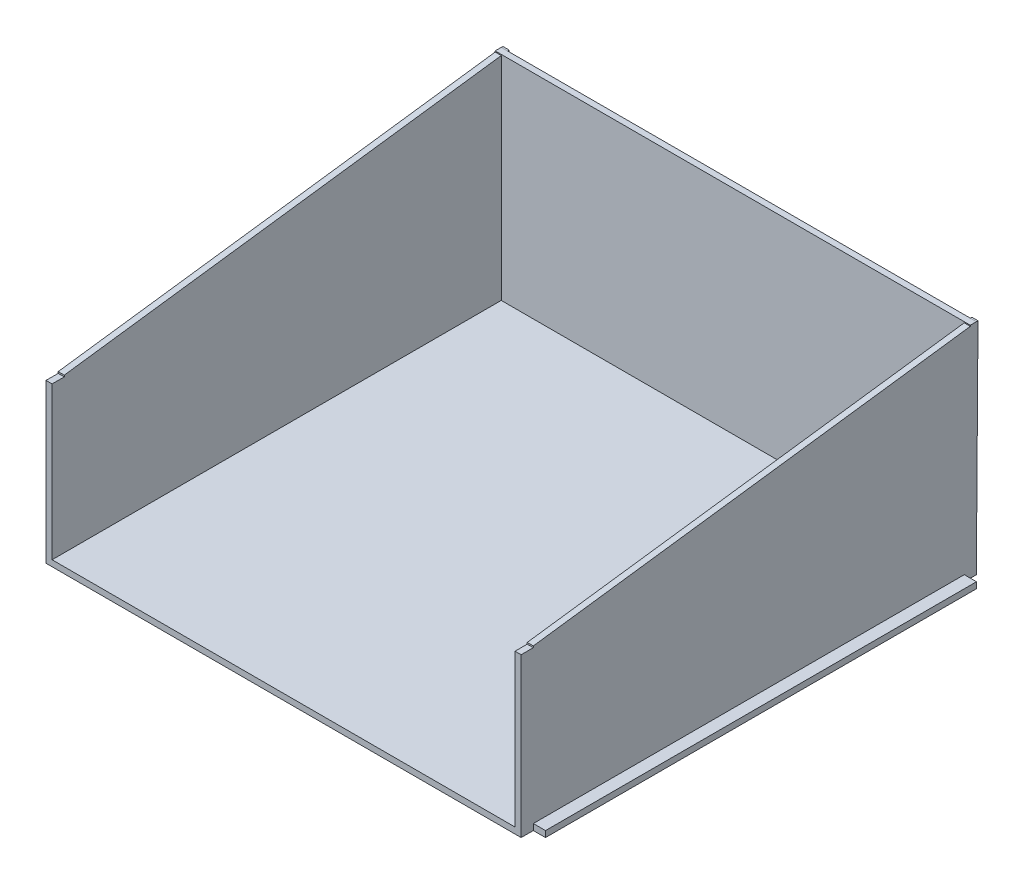
ISO-10303-21;
HEADER;
FILE_DESCRIPTION(('STEP AP214'),'2;1');
FILE_NAME('part.step','',(''),(''),'','','');
FILE_SCHEMA(('AUTOMOTIVE_DESIGN { 1 0 10303 214 1 1 1 1 }'));
ENDSEC;
DATA;
#1=APPLICATION_CONTEXT('core data for automotive mechanical design processes');
#2=APPLICATION_PROTOCOL_DEFINITION('international standard','automotive_design',2000,#1);
#3=PRODUCT_CONTEXT('',#1,'mechanical');
#4=PRODUCT('Part','Part','',(#3));
#5=PRODUCT_RELATED_PRODUCT_CATEGORY('part','',(#4));
#6=PRODUCT_DEFINITION_FORMATION('','',#4);
#7=PRODUCT_DEFINITION_CONTEXT('part definition',#1,'design');
#8=PRODUCT_DEFINITION('design','',#6,#7);
#9=PRODUCT_DEFINITION_SHAPE('','',#8);
#10=(LENGTH_UNIT() NAMED_UNIT(*) SI_UNIT(.MILLI.,.METRE.));
#11=(NAMED_UNIT(*) PLANE_ANGLE_UNIT() SI_UNIT($,.RADIAN.));
#12=(NAMED_UNIT(*) SI_UNIT($,.STERADIAN.) SOLID_ANGLE_UNIT());
#13=UNCERTAINTY_MEASURE_WITH_UNIT(LENGTH_MEASURE(1.E-05),#10,'distance_accuracy_value','');
#14=(GEOMETRIC_REPRESENTATION_CONTEXT(3) GLOBAL_UNCERTAINTY_ASSIGNED_CONTEXT((#13)) GLOBAL_UNIT_ASSIGNED_CONTEXT((#10,
#11,#12)) REPRESENTATION_CONTEXT('',''));
#15=CARTESIAN_POINT('',(0.,0.,0.));
#16=DIRECTION('',(0.,0.,1.));
#17=DIRECTION('',(1.,0.,0.));
#18=AXIS2_PLACEMENT_3D('',#15,#16,#17);
#19=CARTESIAN_POINT('',(380.000000000001,-22.8436612672275,20.));
#20=DIRECTION('',(0.,0.991227900682635,0.132163720091019));
#21=DIRECTION('',(0.,-0.132163720091019,0.991227900682635));
#22=AXIS2_PLACEMENT_3D('',#19,#20,#21);
#23=PLANE('',#22);
#24=DIRECTION('',(0.,-0.132163720091017,0.991227900682635));
#25=VECTOR('',#24,1.);
#26=CARTESIAN_POINT('',(380.000000000001,-20.1769946005609,0.));
#27=LINE('',#26,#25);
#28=CARTESIAN_POINT('',(380.000000000001,-20.1769946005609,0.));
#29=VERTEX_POINT('',#28);
#30=CARTESIAN_POINT('',(380.000000000001,-20.5294311874703,2.64327440182035));
#31=VERTEX_POINT('',#30);
#32=EDGE_CURVE('E317',#29,#31,#27,.T.);
#33=ORIENTED_EDGE('',*,*,#32,.T.);
#34=DIRECTION('',(1.,0.,0.));
#35=VECTOR('',#34,1.);
#36=CARTESIAN_POINT('',(380.000000000001,-20.5294311874703,2.64327440182035));
#37=LINE('',#36,#35);
#38=CARTESIAN_POINT('',(390.000000000001,-20.5294311874703,2.64327440182035));
#39=VERTEX_POINT('',#38);
#40=EDGE_CURVE('E55',#31,#39,#37,.T.);
#41=ORIENTED_EDGE('',*,*,#40,.T.);
#42=DIRECTION('',(0.,-0.132163720091019,0.991227900682635));
#43=VECTOR('',#42,1.);
#44=CARTESIAN_POINT('',(390.000000000001,-22.8436612672276,20.));
#45=LINE('',#44,#43);
#46=CARTESIAN_POINT('',(390.000000000001,-20.1769946005609,0.));
#47=VERTEX_POINT('',#46);
#48=EDGE_CURVE('E523',#47,#39,#45,.T.);
#49=ORIENTED_EDGE('',*,*,#48,.F.);
#50=DIRECTION('',(1.,0.,0.));
#51=VECTOR('',#50,1.);
#52=CARTESIAN_POINT('',(380.000000000001,-20.1769946005609,0.));
#53=LINE('',#52,#51);
#54=EDGE_CURVE('E446',#29,#47,#53,.T.);
#55=ORIENTED_EDGE('',*,*,#54,.F.);
#56=EDGE_LOOP('',(#33,#41,#49,#55));
#57=FACE_BOUND('',#56,.T.);
#58=ADVANCED_FACE('F32',(#57),#23,.T.);
#59=CARTESIAN_POINT('',(380.000000000001,-2.54241072639159E-13,0.));
#60=DIRECTION('',(1.,0.,0.));
#61=DIRECTION('',(0.,1.,0.));
#62=AXIS2_PLACEMENT_3D('',#59,#60,#61);
#63=PLANE('',#62);
#64=DIRECTION('',(0.,-1.,0.));
#65=VECTOR('',#64,1.);
#66=CARTESIAN_POINT('',(380.000000000001,-2.54241072639159E-13,2.64327440182035));
#67=LINE('',#66,#65);
#68=CARTESIAN_POINT('',(380.000000000001,-370.000000000002,2.64327440182035));
#69=VERTEX_POINT('',#68);
#70=EDGE_CURVE('E256',#31,#69,#67,.T.);
#71=ORIENTED_EDGE('',*,*,#70,.F.);
#72=ORIENTED_EDGE('',*,*,#32,.F.);
#73=DIRECTION('',(0.,0.999971454400032,-0.00755581796271107));
#74=VECTOR('',#73,1.);
#75=CARTESIAN_POINT('',(380.000000000001,-370.000000000002,2.64327440182035));
#76=LINE('',#75,#74);
#77=EDGE_CURVE('E324',#69,#29,#76,.T.);
#78=ORIENTED_EDGE('',*,*,#77,.F.);
#79=EDGE_LOOP('',(#71,#72,#78));
#80=FACE_BOUND('',#79,.T.);
#81=ADVANCED_FACE('F478',(#80),#63,.F.);
#82=CARTESIAN_POINT('',(-380.000000000001,-20.1769946005609,0.));
#83=DIRECTION('',(0.,-0.991227900682635,-0.132163720091017));
#84=DIRECTION('',(0.,0.132163720091017,-0.991227900682635));
#85=AXIS2_PLACEMENT_3D('',#82,#83,#84);
#86=PLANE('',#85);
#87=DIRECTION('',(-1.,0.,0.));
#88=VECTOR('',#87,1.);
#89=CARTESIAN_POINT('',(-380.000000000001,-20.5294311874703,2.64327440182035));
#90=LINE('',#89,#88);
#91=CARTESIAN_POINT('',(-380.000000000001,-20.5294311874702,2.64327440182035));
#92=VERTEX_POINT('',#91);
#93=CARTESIAN_POINT('',(-390.000000000001,-20.5294311874703,2.64327440182035));
#94=VERTEX_POINT('',#93);
#95=EDGE_CURVE('E252',#92,#94,#90,.T.);
#96=ORIENTED_EDGE('',*,*,#95,.F.);
#97=DIRECTION('',(0.,-0.132163720091019,0.991227900682635));
#98=VECTOR('',#97,1.);
#99=CARTESIAN_POINT('',(-380.000000000001,-22.8436612672275,20.));
#100=LINE('',#99,#98);
#101=CARTESIAN_POINT('',(-380.000000000001,-20.1769946005609,0.));
#102=VERTEX_POINT('',#101);
#103=EDGE_CURVE('E281',#102,#92,#100,.T.);
#104=ORIENTED_EDGE('',*,*,#103,.F.);
#105=DIRECTION('',(-1.,0.,0.));
#106=VECTOR('',#105,1.);
#107=CARTESIAN_POINT('',(-380.000000000001,-20.1769946005609,0.));
#108=LINE('',#107,#106);
#109=CARTESIAN_POINT('',(-390.000000000001,-20.1769946005609,0.));
#110=VERTEX_POINT('',#109);
#111=EDGE_CURVE('E304',#102,#110,#108,.T.);
#112=ORIENTED_EDGE('',*,*,#111,.T.);
#113=DIRECTION('',(0.,-0.132163720091017,0.991227900682635));
#114=VECTOR('',#113,1.);
#115=CARTESIAN_POINT('',(-390.000000000001,-20.1769946005609,0.));
#116=LINE('',#115,#114);
#117=EDGE_CURVE('E294',#110,#94,#116,.T.);
#118=ORIENTED_EDGE('',*,*,#117,.T.);
#119=EDGE_LOOP('',(#96,#104,#112,#118));
#120=FACE_BOUND('',#119,.T.);
#121=ADVANCED_FACE('F484',(#120),#86,.F.);
#122=CARTESIAN_POINT('',(-380.000000000001,-2.54241072639159E-13,0.));
#123=DIRECTION('',(-1.,0.,0.));
#124=DIRECTION('',(0.,1.,0.));
#125=AXIS2_PLACEMENT_3D('',#122,#123,#124);
#126=PLANE('',#125);
#127=DIRECTION('',(0.,1.,0.));
#128=VECTOR('',#127,1.);
#129=CARTESIAN_POINT('',(-380.000000000001,-2.54241072639159E-13,2.64327440182035));
#130=LINE('',#129,#128);
#131=CARTESIAN_POINT('',(-380.000000000001,-370.000000000001,2.64327440182035));
#132=VERTEX_POINT('',#131);
#133=EDGE_CURVE('E40',#132,#92,#130,.T.);
#134=ORIENTED_EDGE('',*,*,#133,.F.);
#135=DIRECTION('',(0.,0.999971454400032,-0.00755581796271107));
#136=VECTOR('',#135,1.);
#137=CARTESIAN_POINT('',(-380.000000000001,-370.000000000002,2.64327440182035));
#138=LINE('',#137,#136);
#139=EDGE_CURVE('E283',#132,#102,#138,.T.);
#140=ORIENTED_EDGE('',*,*,#139,.T.);
#141=ORIENTED_EDGE('',*,*,#103,.T.);
#142=EDGE_LOOP('',(#134,#140,#141));
#143=FACE_BOUND('',#142,.T.);
#144=ADVANCED_FACE('F562',(#143),#126,.F.);
#145=CARTESIAN_POINT('',(0.,-370.000000000001,0.));
#146=DIRECTION('',(0.,1.,0.));
#147=DIRECTION('',(0.,0.,1.));
#148=AXIS2_PLACEMENT_3D('',#145,#146,#147);
#149=PLANE('',#148);
#150=DIRECTION('',(1.,0.,0.));
#151=VECTOR('',#150,1.);
#152=CARTESIAN_POINT('',(0.,-370.000000000001,12.6432744018203));
#153=LINE('',#152,#151);
#154=CARTESIAN_POINT('',(-380.000000000001,-370.000000000002,12.6432744018203));
#155=VERTEX_POINT('',#154);
#156=CARTESIAN_POINT('',(380.000000000001,-370.000000000002,12.6432744018203));
#157=VERTEX_POINT('',#156);
#158=EDGE_CURVE('E264',#155,#157,#153,.T.);
#159=ORIENTED_EDGE('',*,*,#158,.F.);
#160=DIRECTION('',(0.,0.,-1.));
#161=VECTOR('',#160,1.);
#162=CARTESIAN_POINT('',(-380.000000000001,-370.000000000002,750.));
#163=LINE('',#162,#161);
#164=CARTESIAN_POINT('',(-380.000000000001,-370.000000000001,750.));
#165=VERTEX_POINT('',#164);
#166=EDGE_CURVE('E286',#165,#155,#163,.T.);
#167=ORIENTED_EDGE('',*,*,#166,.F.);
#168=DIRECTION('',(1.,0.,0.));
#169=VECTOR('',#168,1.);
#170=CARTESIAN_POINT('',(-390.000000000001,-370.000000000001,750.));
#171=LINE('',#170,#169);
#172=CARTESIAN_POINT('',(380.000000000001,-370.000000000002,750.));
#173=VERTEX_POINT('',#172);
#174=EDGE_CURVE('E351',#165,#173,#171,.T.);
#175=ORIENTED_EDGE('',*,*,#174,.T.);
#176=DIRECTION('',(0.,0.,-1.));
#177=VECTOR('',#176,1.);
#178=CARTESIAN_POINT('',(380.000000000001,-370.000000000002,750.));
#179=LINE('',#178,#177);
#180=EDGE_CURVE('E320',#173,#157,#179,.T.);
#181=ORIENTED_EDGE('',*,*,#180,.T.);
#182=EDGE_LOOP('',(#159,#167,#175,#181));
#183=FACE_BOUND('',#182,.T.);
#184=ADVANCED_FACE('F474',(#183),#149,.T.);
#185=DIRECTION('',(0.,0.,-1.));
#186=VECTOR('',#185,1.);
#187=CARTESIAN_POINT('',(-390.000000000001,-370.000000000002,750.));
#188=LINE('',#187,#186);
#189=CARTESIAN_POINT('',(-390.000000000001,-370.000000000001,730.));
#190=VERTEX_POINT('',#189);
#191=CARTESIAN_POINT('',(-390.000000000001,-370.000000000002,22.467832415473));
#192=VERTEX_POINT('',#191);
#193=EDGE_CURVE('E276',#190,#192,#188,.T.);
#194=ORIENTED_EDGE('',*,*,#193,.T.);
#195=DIRECTION('',(-1.,0.,0.));
#196=VECTOR('',#195,1.);
#197=CARTESIAN_POINT('',(-390.000000000001,-370.000000000001,22.467832415473));
#198=LINE('',#197,#196);
#199=CARTESIAN_POINT('',(-410.000000000001,-370.000000000001,22.467832415473));
#200=VERTEX_POINT('',#199);
#201=EDGE_CURVE('E376',#192,#200,#198,.T.);
#202=ORIENTED_EDGE('',*,*,#201,.T.);
#203=DIRECTION('',(0.,0.,1.));
#204=VECTOR('',#203,1.);
#205=CARTESIAN_POINT('',(-410.000000000001,-370.000000000001,22.467832415473));
#206=LINE('',#205,#204);
#207=CARTESIAN_POINT('',(-410.000000000001,-370.000000000001,730.));
#208=VERTEX_POINT('',#207);
#209=EDGE_CURVE('E407',#200,#208,#206,.T.);
#210=ORIENTED_EDGE('',*,*,#209,.T.);
#211=DIRECTION('',(1.,0.,0.));
#212=VECTOR('',#211,1.);
#213=CARTESIAN_POINT('',(-410.000000000001,-370.000000000001,730.));
#214=LINE('',#213,#212);
#215=EDGE_CURVE('E368',#208,#190,#214,.T.);
#216=ORIENTED_EDGE('',*,*,#215,.T.);
#217=EDGE_LOOP('',(#194,#202,#210,#216));
#218=FACE_BOUND('',#217,.T.);
#219=ADVANCED_FACE('F453',(#218),#149,.T.);
#220=CARTESIAN_POINT('',(-410.000000000001,-370.000000000001,22.467832415473));
#221=DIRECTION('',(1.,0.,0.));
#222=DIRECTION('',(0.,1.,0.));
#223=AXIS2_PLACEMENT_3D('',#220,#221,#222);
#224=PLANE('',#223);
#225=DIRECTION('',(0.,0.,1.));
#226=VECTOR('',#225,1.);
#227=CARTESIAN_POINT('',(-410.000000000001,-380.000000000001,22.467832415473));
#228=LINE('',#227,#226);
#229=CARTESIAN_POINT('',(-410.000000000001,-380.000000000001,22.467832415473));
#230=VERTEX_POINT('',#229);
#231=CARTESIAN_POINT('',(-410.000000000001,-380.000000000001,730.));
#232=VERTEX_POINT('',#231);
#233=EDGE_CURVE('E427',#230,#232,#228,.T.);
#234=ORIENTED_EDGE('',*,*,#233,.T.);
#235=DIRECTION('',(0.,-1.,0.));
#236=VECTOR('',#235,1.);
#237=CARTESIAN_POINT('',(-410.000000000001,-370.000000000001,730.));
#238=LINE('',#237,#236);
#239=EDGE_CURVE('E340',#208,#232,#238,.T.);
#240=ORIENTED_EDGE('',*,*,#239,.F.);
#241=ORIENTED_EDGE('',*,*,#209,.F.);
#242=DIRECTION('',(0.,-1.,0.));
#243=VECTOR('',#242,1.);
#244=CARTESIAN_POINT('',(-410.000000000001,-370.000000000001,22.467832415473));
#245=LINE('',#244,#243);
#246=EDGE_CURVE('E402',#200,#230,#245,.T.);
#247=ORIENTED_EDGE('',*,*,#246,.T.);
#248=EDGE_LOOP('',(#234,#240,#241,#247));
#249=FACE_BOUND('',#248,.T.);
#250=ADVANCED_FACE('F34',(#249),#224,.F.);
#251=CARTESIAN_POINT('',(-410.000000000001,-370.000000000001,730.));
#252=DIRECTION('',(0.,0.,-1.));
#253=DIRECTION('',(-1.,0.,0.));
#254=AXIS2_PLACEMENT_3D('',#251,#252,#253);
#255=PLANE('',#254);
#256=DIRECTION('',(1.,0.,0.));
#257=VECTOR('',#256,1.);
#258=CARTESIAN_POINT('',(-410.000000000001,-380.000000000001,730.));
#259=LINE('',#258,#257);
#260=CARTESIAN_POINT('',(-390.000000000001,-380.000000000001,730.));
#261=VERTEX_POINT('',#260);
#262=EDGE_CURVE('E426',#232,#261,#259,.T.);
#263=ORIENTED_EDGE('',*,*,#262,.T.);
#264=DIRECTION('',(0.,-1.,0.));
#265=VECTOR('',#264,1.);
#266=CARTESIAN_POINT('',(-390.000000000001,-370.000000000001,730.));
#267=LINE('',#266,#265);
#268=EDGE_CURVE('E382',#190,#261,#267,.T.);
#269=ORIENTED_EDGE('',*,*,#268,.F.);
#270=ORIENTED_EDGE('',*,*,#215,.F.);
#271=ORIENTED_EDGE('',*,*,#239,.T.);
#272=EDGE_LOOP('',(#263,#269,#270,#271));
#273=FACE_BOUND('',#272,.T.);
#274=ADVANCED_FACE('F456',(#273),#255,.F.);
#275=CARTESIAN_POINT('',(-390.000000000001,-370.000000000001,750.));
#276=DIRECTION('',(0.,0.,-1.));
#277=DIRECTION('',(-1.,0.,0.));
#278=AXIS2_PLACEMENT_3D('',#275,#276,#277);
#279=PLANE('',#278);
#280=DIRECTION('',(1.,0.,0.));
#281=VECTOR('',#280,1.);
#282=CARTESIAN_POINT('',(-390.000000000001,-380.000000000001,750.));
#283=LINE('',#282,#281);
#284=CARTESIAN_POINT('',(-390.000000000001,-380.000000000001,750.));
#285=VERTEX_POINT('',#284);
#286=CARTESIAN_POINT('',(390.000000000001,-380.000000000002,750.));
#287=VERTEX_POINT('',#286);
#288=EDGE_CURVE('E422',#285,#287,#283,.T.);
#289=ORIENTED_EDGE('',*,*,#288,.T.);
#290=DIRECTION('',(0.,-1.,0.));
#291=VECTOR('',#290,1.);
#292=CARTESIAN_POINT('',(390.000000000001,-370.000000000002,750.));
#293=LINE('',#292,#291);
#294=CARTESIAN_POINT('',(390.000000000001,-119.999999999999,750.));
#295=VERTEX_POINT('',#294);
#296=EDGE_CURVE('E344',#295,#287,#293,.T.);
#297=ORIENTED_EDGE('',*,*,#296,.F.);
#298=DIRECTION('',(1.,0.,0.));
#299=VECTOR('',#298,1.);
#300=CARTESIAN_POINT('',(380.000000000001,-119.999999999999,750.));
#301=LINE('',#300,#299);
#302=CARTESIAN_POINT('',(380.000000000001,-119.999999999999,750.));
#303=VERTEX_POINT('',#302);
#304=EDGE_CURVE('E429',#303,#295,#301,.T.);
#305=ORIENTED_EDGE('',*,*,#304,.F.);
#306=DIRECTION('',(0.,-1.,0.));
#307=VECTOR('',#306,1.);
#308=CARTESIAN_POINT('',(380.000000000001,-119.999999999999,750.));
#309=LINE('',#308,#307);
#310=EDGE_CURVE('E325',#303,#173,#309,.T.);
#311=ORIENTED_EDGE('',*,*,#310,.T.);
#312=ORIENTED_EDGE('',*,*,#174,.F.);
#313=DIRECTION('',(0.,-1.,0.));
#314=VECTOR('',#313,1.);
#315=CARTESIAN_POINT('',(-380.000000000001,-119.999999999999,750.));
#316=LINE('',#315,#314);
#317=CARTESIAN_POINT('',(-380.000000000001,-119.999999999999,750.));
#318=VERTEX_POINT('',#317);
#319=EDGE_CURVE('E272',#318,#165,#316,.T.);
#320=ORIENTED_EDGE('',*,*,#319,.F.);
#321=DIRECTION('',(-1.,0.,0.));
#322=VECTOR('',#321,1.);
#323=CARTESIAN_POINT('',(-380.000000000001,-119.999999999999,750.));
#324=LINE('',#323,#322);
#325=CARTESIAN_POINT('',(-390.000000000001,-119.999999999999,750.));
#326=VERTEX_POINT('',#325);
#327=EDGE_CURVE('E289',#318,#326,#324,.T.);
#328=ORIENTED_EDGE('',*,*,#327,.T.);
#329=DIRECTION('',(0.,-1.,0.));
#330=VECTOR('',#329,1.);
#331=CARTESIAN_POINT('',(-390.000000000001,-370.000000000001,750.));
#332=LINE('',#331,#330);
#333=EDGE_CURVE('E385',#326,#285,#332,.T.);
#334=ORIENTED_EDGE('',*,*,#333,.T.);
#335=EDGE_LOOP('',(#289,#297,#305,#311,#312,#320,#328,#334));
#336=FACE_BOUND('',#335,.T.);
#337=ADVANCED_FACE('F473',(#336),#279,.F.);
#338=CARTESIAN_POINT('',(390.000000000001,-370.000000000002,730.));
#339=DIRECTION('',(0.,0.,-1.));
#340=DIRECTION('',(-1.,0.,0.));
#341=AXIS2_PLACEMENT_3D('',#338,#339,#340);
#342=PLANE('',#341);
#343=DIRECTION('',(1.,0.,0.));
#344=VECTOR('',#343,1.);
#345=CARTESIAN_POINT('',(390.000000000001,-380.000000000002,730.));
#346=LINE('',#345,#344);
#347=CARTESIAN_POINT('',(390.000000000001,-380.000000000002,730.));
#348=VERTEX_POINT('',#347);
#349=CARTESIAN_POINT('',(410.000000000001,-380.000000000002,730.));
#350=VERTEX_POINT('',#349);
#351=EDGE_CURVE('E418',#348,#350,#346,.T.);
#352=ORIENTED_EDGE('',*,*,#351,.T.);
#353=DIRECTION('',(0.,-1.,0.));
#354=VECTOR('',#353,1.);
#355=CARTESIAN_POINT('',(410.000000000001,-370.000000000002,730.));
#356=LINE('',#355,#354);
#357=CARTESIAN_POINT('',(410.000000000001,-370.000000000002,730.));
#358=VERTEX_POINT('',#357);
#359=EDGE_CURVE('E345',#358,#350,#356,.T.);
#360=ORIENTED_EDGE('',*,*,#359,.F.);
#361=DIRECTION('',(1.,0.,0.));
#362=VECTOR('',#361,1.);
#363=CARTESIAN_POINT('',(390.000000000001,-370.000000000002,730.));
#364=LINE('',#363,#362);
#365=CARTESIAN_POINT('',(390.000000000001,-370.000000000002,730.));
#366=VERTEX_POINT('',#365);
#367=EDGE_CURVE('E348',#366,#358,#364,.T.);
#368=ORIENTED_EDGE('',*,*,#367,.F.);
#369=DIRECTION('',(0.,-1.,0.));
#370=VECTOR('',#369,1.);
#371=CARTESIAN_POINT('',(390.000000000001,-370.000000000002,730.));
#372=LINE('',#371,#370);
#373=EDGE_CURVE('E341',#366,#348,#372,.T.);
#374=ORIENTED_EDGE('',*,*,#373,.T.);
#375=EDGE_LOOP('',(#352,#360,#368,#374));
#376=FACE_BOUND('',#375,.T.);
#377=ADVANCED_FACE('F536',(#376),#342,.F.);
#378=CARTESIAN_POINT('',(410.000000000001,-370.000000000002,730.));
#379=DIRECTION('',(-1.,0.,0.));
#380=DIRECTION('',(0.,-1.,0.));
#381=AXIS2_PLACEMENT_3D('',#378,#379,#380);
#382=PLANE('',#381);
#383=DIRECTION('',(0.,0.,-1.));
#384=VECTOR('',#383,1.);
#385=CARTESIAN_POINT('',(410.000000000001,-380.000000000002,730.));
#386=LINE('',#385,#384);
#387=CARTESIAN_POINT('',(410.000000000001,-380.000000000002,22.467832415473));
#388=VERTEX_POINT('',#387);
#389=EDGE_CURVE('E416',#350,#388,#386,.T.);
#390=ORIENTED_EDGE('',*,*,#389,.T.);
#391=DIRECTION('',(0.,-1.,0.));
#392=VECTOR('',#391,1.);
#393=CARTESIAN_POINT('',(410.000000000001,-370.000000000002,22.467832415473));
#394=LINE('',#393,#392);
#395=CARTESIAN_POINT('',(410.000000000001,-370.000000000002,22.467832415473));
#396=VERTEX_POINT('',#395);
#397=EDGE_CURVE('E363',#396,#388,#394,.T.);
#398=ORIENTED_EDGE('',*,*,#397,.F.);
#399=DIRECTION('',(0.,0.,-1.));
#400=VECTOR('',#399,1.);
#401=CARTESIAN_POINT('',(410.000000000001,-370.000000000002,730.));
#402=LINE('',#401,#400);
#403=EDGE_CURVE('E350',#358,#396,#402,.T.);
#404=ORIENTED_EDGE('',*,*,#403,.F.);
#405=ORIENTED_EDGE('',*,*,#359,.T.);
#406=EDGE_LOOP('',(#390,#398,#404,#405));
#407=FACE_BOUND('',#406,.T.);
#408=ADVANCED_FACE('F540',(#407),#382,.F.);
#409=CARTESIAN_POINT('',(410.000000000001,-370.000000000002,22.467832415473));
#410=DIRECTION('',(0.,0.,1.));
#411=DIRECTION('',(1.,0.,0.));
#412=AXIS2_PLACEMENT_3D('',#409,#410,#411);
#413=PLANE('',#412);
#414=DIRECTION('',(-1.,0.,0.));
#415=VECTOR('',#414,1.);
#416=CARTESIAN_POINT('',(410.000000000001,-380.000000000002,22.467832415473));
#417=LINE('',#416,#415);
#418=CARTESIAN_POINT('',(390.000000000001,-380.000000000002,22.467832415473));
#419=VERTEX_POINT('',#418);
#420=EDGE_CURVE('E414',#388,#419,#417,.T.);
#421=ORIENTED_EDGE('',*,*,#420,.T.);
#422=DIRECTION('',(0.,-1.,0.));
#423=VECTOR('',#422,1.);
#424=CARTESIAN_POINT('',(390.000000000001,-370.000000000002,22.467832415473));
#425=LINE('',#424,#423);
#426=CARTESIAN_POINT('',(390.000000000001,-370.000000000002,22.467832415473));
#427=VERTEX_POINT('',#426);
#428=EDGE_CURVE('E360',#427,#419,#425,.T.);
#429=ORIENTED_EDGE('',*,*,#428,.F.);
#430=DIRECTION('',(-1.,0.,0.));
#431=VECTOR('',#430,1.);
#432=CARTESIAN_POINT('',(410.000000000001,-370.000000000002,22.467832415473));
#433=LINE('',#432,#431);
#434=EDGE_CURVE('E354',#396,#427,#433,.T.);
#435=ORIENTED_EDGE('',*,*,#434,.F.);
#436=ORIENTED_EDGE('',*,*,#397,.T.);
#437=EDGE_LOOP('',(#421,#429,#435,#436));
#438=FACE_BOUND('',#437,.T.);
#439=ADVANCED_FACE('F608',(#438),#413,.F.);
#440=CARTESIAN_POINT('',(390.000000000001,-370.000000000002,22.467832415473));
#441=DIRECTION('',(-1.,0.,0.));
#442=DIRECTION('',(0.,-1.,0.));
#443=AXIS2_PLACEMENT_3D('',#440,#441,#442);
#444=PLANE('',#443);
#445=DIRECTION('',(0.,0.,-1.));
#446=VECTOR('',#445,1.);
#447=CARTESIAN_POINT('',(390.000000000001,-380.000000000002,22.467832415473));
#448=LINE('',#447,#446);
#449=CARTESIAN_POINT('',(390.000000000001,-380.000000000002,2.64327440182035));
#450=VERTEX_POINT('',#449);
#451=EDGE_CURVE('E412',#419,#450,#448,.T.);
#452=ORIENTED_EDGE('',*,*,#451,.T.);
#453=DIRECTION('',(0.,-1.,0.));
#454=VECTOR('',#453,1.);
#455=CARTESIAN_POINT('',(390.000000000001,-370.000000000002,2.64327440182035));
#456=LINE('',#455,#454);
#457=CARTESIAN_POINT('',(390.000000000001,-370.000000000002,2.64327440182035));
#458=VERTEX_POINT('',#457);
#459=EDGE_CURVE('E364',#458,#450,#456,.T.);
#460=ORIENTED_EDGE('',*,*,#459,.F.);
#461=DIRECTION('',(0.,0.999971454400032,-0.00755581796271107));
#462=VECTOR('',#461,1.);
#463=CARTESIAN_POINT('',(390.000000000001,-370.000000000002,2.64327440182035));
#464=LINE('',#463,#462);
#465=EDGE_CURVE('E303',#458,#47,#464,.T.);
#466=ORIENTED_EDGE('',*,*,#465,.T.);
#467=ORIENTED_EDGE('',*,*,#48,.T.);
#468=DIRECTION('',(0.,-1.,0.));
#469=VECTOR('',#468,1.);
#470=CARTESIAN_POINT('',(390.000000000001,-380.000000000002,2.64327440182035));
#471=LINE('',#470,#469);
#472=CARTESIAN_POINT('',(390.000000000001,-20.1769946005609,2.64327440182035));
#473=VERTEX_POINT('',#472);
#474=EDGE_CURVE('E246',#473,#39,#471,.T.);
#475=ORIENTED_EDGE('',*,*,#474,.F.);
#476=DIRECTION('',(0.,0.,-1.));
#477=VECTOR('',#476,1.);
#478=CARTESIAN_POINT('',(390.000000000001,-20.1769946005609,12.6432744018203));
#479=LINE('',#478,#477);
#480=CARTESIAN_POINT('',(390.000000000001,-20.1769946005609,12.6432744018203));
#481=VERTEX_POINT('',#480);
#482=EDGE_CURVE('E237',#481,#473,#479,.T.);
#483=ORIENTED_EDGE('',*,*,#482,.F.);
#484=DIRECTION('',(0.,-1.,0.));
#485=VECTOR('',#484,1.);
#486=CARTESIAN_POINT('',(390.000000000001,-380.000000000002,12.6432744018203));
#487=LINE('',#486,#485);
#488=CARTESIAN_POINT('',(390.000000000001,-21.8627645208036,12.6432744018204));
#489=VERTEX_POINT('',#488);
#490=EDGE_CURVE('E230',#481,#489,#487,.T.);
#491=ORIENTED_EDGE('',*,*,#490,.T.);
#492=CARTESIAN_POINT('',(390.000000000001,-117.510327933895,730.));
#493=VERTEX_POINT('',#492);
#494=EDGE_CURVE('E47',#489,#493,#45,.T.);
#495=ORIENTED_EDGE('',*,*,#494,.T.);
#496=DIRECTION('',(0.,-1.,0.));
#497=VECTOR('',#496,1.);
#498=CARTESIAN_POINT('',(390.000000000001,-117.510327933895,730.));
#499=LINE('',#498,#497);
#500=CARTESIAN_POINT('',(390.000000000001,-119.999999999999,730.));
#501=VERTEX_POINT('',#500);
#502=EDGE_CURVE('E524',#493,#501,#499,.T.);
#503=ORIENTED_EDGE('',*,*,#502,.T.);
#504=DIRECTION('',(0.,0.,1.));
#505=VECTOR('',#504,1.);
#506=CARTESIAN_POINT('',(390.000000000001,-119.999999999999,730.));
#507=LINE('',#506,#505);
#508=EDGE_CURVE('E335',#501,#295,#507,.T.);
#509=ORIENTED_EDGE('',*,*,#508,.T.);
#510=ORIENTED_EDGE('',*,*,#296,.T.);
#511=DIRECTION('',(0.,0.,-1.));
#512=VECTOR('',#511,1.);
#513=CARTESIAN_POINT('',(390.000000000001,-380.000000000002,750.));
#514=LINE('',#513,#512);
#515=EDGE_CURVE('E420',#287,#348,#514,.T.);
#516=ORIENTED_EDGE('',*,*,#515,.T.);
#517=ORIENTED_EDGE('',*,*,#373,.F.);
#518=DIRECTION('',(0.,0.,-1.));
#519=VECTOR('',#518,1.);
#520=CARTESIAN_POINT('',(390.000000000001,-370.000000000002,750.));
#521=LINE('',#520,#519);
#522=EDGE_CURVE('E338',#366,#427,#521,.T.);
#523=ORIENTED_EDGE('',*,*,#522,.T.);
#524=ORIENTED_EDGE('',*,*,#428,.T.);
#525=EDGE_LOOP('',(#452,#460,#466,#467,#475,#483,#491,#495,#503,#509,#510,#516,#517,#523,#524));
#526=FACE_BOUND('',#525,.T.);
#527=ADVANCED_FACE('F528',(#526),#444,.F.);
#528=CARTESIAN_POINT('',(390.000000000001,-370.000000000002,2.64327440182035));
#529=DIRECTION('',(0.,0.,1.));
#530=DIRECTION('',(1.,0.,0.));
#531=AXIS2_PLACEMENT_3D('',#528,#529,#530);
#532=PLANE('',#531);
#533=DIRECTION('',(-1.,0.,0.));
#534=VECTOR('',#533,1.);
#535=CARTESIAN_POINT('',(390.000000000001,-380.000000000002,2.64327440182035));
#536=LINE('',#535,#534);
#537=CARTESIAN_POINT('',(-390.000000000001,-380.000000000001,2.64327440182035));
#538=VERTEX_POINT('',#537);
#539=EDGE_CURVE('E410',#450,#538,#536,.T.);
#540=ORIENTED_EDGE('',*,*,#539,.T.);
#541=DIRECTION('',(0.,-1.,0.));
#542=VECTOR('',#541,1.);
#543=CARTESIAN_POINT('',(-390.000000000001,-370.000000000001,2.64327440182035));
#544=LINE('',#543,#542);
#545=CARTESIAN_POINT('',(-390.000000000001,-370.000000000001,2.64327440182035));
#546=VERTEX_POINT('',#545);
#547=EDGE_CURVE('E396',#546,#538,#544,.T.);
#548=ORIENTED_EDGE('',*,*,#547,.F.);
#549=DIRECTION('',(-1.,0.,0.));
#550=VECTOR('',#549,1.);
#551=CARTESIAN_POINT('',(-380.000000000001,-370.000000000002,2.64327440182035));
#552=LINE('',#551,#550);
#553=EDGE_CURVE('E300',#132,#546,#552,.T.);
#554=ORIENTED_EDGE('',*,*,#553,.F.);
#555=ORIENTED_EDGE('',*,*,#133,.T.);
#556=ORIENTED_EDGE('',*,*,#95,.T.);
#557=DIRECTION('',(0.,1.,0.));
#558=VECTOR('',#557,1.);
#559=CARTESIAN_POINT('',(-390.000000000001,-380.000000000002,2.64327440182035));
#560=LINE('',#559,#558);
#561=CARTESIAN_POINT('',(-390.000000000001,-20.1769946005609,2.64327440182035));
#562=VERTEX_POINT('',#561);
#563=EDGE_CURVE('E249',#94,#562,#560,.T.);
#564=ORIENTED_EDGE('',*,*,#563,.T.);
#565=DIRECTION('',(1.,0.,0.));
#566=VECTOR('',#565,1.);
#567=CARTESIAN_POINT('',(390.000000000001,-20.1769946005609,2.64327440182035));
#568=LINE('',#567,#566);
#569=EDGE_CURVE('E236',#562,#473,#568,.T.);
#570=ORIENTED_EDGE('',*,*,#569,.T.);
#571=ORIENTED_EDGE('',*,*,#474,.T.);
#572=ORIENTED_EDGE('',*,*,#40,.F.);
#573=ORIENTED_EDGE('',*,*,#70,.T.);
#574=DIRECTION('',(-1.,0.,0.));
#575=VECTOR('',#574,1.);
#576=CARTESIAN_POINT('',(390.000000000001,-370.000000000002,2.64327440182035));
#577=LINE('',#576,#575);
#578=EDGE_CURVE('E357',#458,#69,#577,.T.);
#579=ORIENTED_EDGE('',*,*,#578,.F.);
#580=ORIENTED_EDGE('',*,*,#459,.T.);
#581=EDGE_LOOP('',(#540,#548,#554,#555,#556,#564,#570,#571,#572,#573,#579,#580));
#582=FACE_BOUND('',#581,.T.);
#583=ADVANCED_FACE('F549',(#582),#532,.F.);
#584=CARTESIAN_POINT('',(-390.000000000001,-370.000000000001,2.64327440182035));
#585=DIRECTION('',(1.,0.,0.));
#586=DIRECTION('',(0.,1.,0.));
#587=AXIS2_PLACEMENT_3D('',#584,#585,#586);
#588=PLANE('',#587);
#589=CARTESIAN_POINT('',(-390.000000000001,-21.8627645208036,12.6432744018204));
#590=VERTEX_POINT('',#589);
#591=CARTESIAN_POINT('',(-390.000000000001,-117.510327933895,730.));
#592=VERTEX_POINT('',#591);
#593=EDGE_CURVE('E225',#590,#592,#116,.T.);
#594=ORIENTED_EDGE('',*,*,#593,.F.);
#595=DIRECTION('',(0.,1.,0.));
#596=VECTOR('',#595,1.);
#597=CARTESIAN_POINT('',(-390.000000000001,-380.000000000002,12.6432744018203));
#598=LINE('',#597,#596);
#599=CARTESIAN_POINT('',(-390.000000000001,-20.1769946005609,12.6432744018203));
#600=VERTEX_POINT('',#599);
#601=EDGE_CURVE('E218',#590,#600,#598,.T.);
#602=ORIENTED_EDGE('',*,*,#601,.T.);
#603=DIRECTION('',(0.,0.,-1.));
#604=VECTOR('',#603,1.);
#605=CARTESIAN_POINT('',(-390.000000000001,-20.1769946005609,12.6432744018203));
#606=LINE('',#605,#604);
#607=EDGE_CURVE('E222',#600,#562,#606,.T.);
#608=ORIENTED_EDGE('',*,*,#607,.T.);
#609=ORIENTED_EDGE('',*,*,#563,.F.);
#610=ORIENTED_EDGE('',*,*,#117,.F.);
#611=DIRECTION('',(0.,0.999971454400032,-0.00755581796271107));
#612=VECTOR('',#611,1.);
#613=CARTESIAN_POINT('',(-390.000000000001,-370.000000000002,2.64327440182035));
#614=LINE('',#613,#612);
#615=EDGE_CURVE('E296',#546,#110,#614,.T.);
#616=ORIENTED_EDGE('',*,*,#615,.F.);
#617=ORIENTED_EDGE('',*,*,#547,.T.);
#618=DIRECTION('',(0.,0.,1.));
#619=VECTOR('',#618,1.);
#620=CARTESIAN_POINT('',(-390.000000000001,-380.000000000001,2.64327440182035));
#621=LINE('',#620,#619);
#622=CARTESIAN_POINT('',(-390.000000000001,-380.000000000001,22.467832415473));
#623=VERTEX_POINT('',#622);
#624=EDGE_CURVE('E408',#538,#623,#621,.T.);
#625=ORIENTED_EDGE('',*,*,#624,.T.);
#626=DIRECTION('',(0.,-1.,0.));
#627=VECTOR('',#626,1.);
#628=CARTESIAN_POINT('',(-390.000000000001,-370.000000000001,22.467832415473));
#629=LINE('',#628,#627);
#630=EDGE_CURVE('E399',#192,#623,#629,.T.);
#631=ORIENTED_EDGE('',*,*,#630,.F.);
#632=ORIENTED_EDGE('',*,*,#193,.F.);
#633=ORIENTED_EDGE('',*,*,#268,.T.);
#634=DIRECTION('',(0.,0.,1.));
#635=VECTOR('',#634,1.);
#636=CARTESIAN_POINT('',(-390.000000000001,-380.000000000001,730.));
#637=LINE('',#636,#635);
#638=EDGE_CURVE('E424',#261,#285,#637,.T.);
#639=ORIENTED_EDGE('',*,*,#638,.T.);
#640=ORIENTED_EDGE('',*,*,#333,.F.);
#641=DIRECTION('',(0.,0.,1.));
#642=VECTOR('',#641,1.);
#643=CARTESIAN_POINT('',(-390.000000000001,-119.999999999999,730.));
#644=LINE('',#643,#642);
#645=CARTESIAN_POINT('',(-390.000000000001,-119.999999999999,730.));
#646=VERTEX_POINT('',#645);
#647=EDGE_CURVE('E271',#646,#326,#644,.T.);
#648=ORIENTED_EDGE('',*,*,#647,.F.);
#649=DIRECTION('',(0.,-1.,0.));
#650=VECTOR('',#649,1.);
#651=CARTESIAN_POINT('',(-390.000000000001,-117.510327933895,730.));
#652=LINE('',#651,#650);
#653=EDGE_CURVE('E292',#592,#646,#652,.T.);
#654=ORIENTED_EDGE('',*,*,#653,.F.);
#655=EDGE_LOOP('',(#594,#602,#608,#609,#610,#616,#617,#625,#631,#632,#633,#639,#640,#648,#654));
#656=FACE_BOUND('',#655,.T.);
#657=ADVANCED_FACE('F220',(#656),#588,.F.);
#658=CARTESIAN_POINT('',(-390.000000000001,-370.000000000001,22.467832415473));
#659=DIRECTION('',(0.,0.,1.));
#660=DIRECTION('',(1.,0.,0.));
#661=AXIS2_PLACEMENT_3D('',#658,#659,#660);
#662=PLANE('',#661);
#663=DIRECTION('',(-1.,0.,0.));
#664=VECTOR('',#663,1.);
#665=CARTESIAN_POINT('',(-390.000000000001,-380.000000000001,22.467832415473));
#666=LINE('',#665,#664);
#667=EDGE_CURVE('E405',#623,#230,#666,.T.);
#668=ORIENTED_EDGE('',*,*,#667,.T.);
#669=ORIENTED_EDGE('',*,*,#246,.F.);
#670=ORIENTED_EDGE('',*,*,#201,.F.);
#671=ORIENTED_EDGE('',*,*,#630,.T.);
#672=EDGE_LOOP('',(#668,#669,#670,#671));
#673=FACE_BOUND('',#672,.T.);
#674=ADVANCED_FACE('F462',(#673),#662,.F.);
#675=ORIENTED_EDGE('',*,*,#522,.F.);
#676=ORIENTED_EDGE('',*,*,#367,.T.);
#677=ORIENTED_EDGE('',*,*,#403,.T.);
#678=ORIENTED_EDGE('',*,*,#434,.T.);
#679=EDGE_LOOP('',(#675,#676,#677,#678));
#680=FACE_BOUND('',#679,.T.);
#681=ADVANCED_FACE('F476',(#680),#149,.T.);
#682=CARTESIAN_POINT('',(0.,-380.000000000001,0.));
#683=DIRECTION('',(0.,1.,0.));
#684=DIRECTION('',(0.,0.,1.));
#685=AXIS2_PLACEMENT_3D('',#682,#683,#684);
#686=PLANE('',#685);
#687=ORIENTED_EDGE('',*,*,#667,.F.);
#688=ORIENTED_EDGE('',*,*,#624,.F.);
#689=ORIENTED_EDGE('',*,*,#539,.F.);
#690=ORIENTED_EDGE('',*,*,#451,.F.);
#691=ORIENTED_EDGE('',*,*,#420,.F.);
#692=ORIENTED_EDGE('',*,*,#389,.F.);
#693=ORIENTED_EDGE('',*,*,#351,.F.);
#694=ORIENTED_EDGE('',*,*,#515,.F.);
#695=ORIENTED_EDGE('',*,*,#288,.F.);
#696=ORIENTED_EDGE('',*,*,#638,.F.);
#697=ORIENTED_EDGE('',*,*,#262,.F.);
#698=ORIENTED_EDGE('',*,*,#233,.F.);
#699=EDGE_LOOP('',(#687,#688,#689,#690,#691,#692,#693,#694,#695,#696,#697,#698));
#700=FACE_BOUND('',#699,.T.);
#701=ADVANCED_FACE('F465',(#700),#686,.F.);
#702=CARTESIAN_POINT('',(380.000000000001,-119.999999999999,730.));
#703=DIRECTION('',(0.,1.,0.));
#704=DIRECTION('',(-1.,0.,0.));
#705=AXIS2_PLACEMENT_3D('',#702,#703,#704);
#706=PLANE('',#705);
#707=ORIENTED_EDGE('',*,*,#508,.F.);
#708=DIRECTION('',(1.,0.,0.));
#709=VECTOR('',#708,1.);
#710=CARTESIAN_POINT('',(380.000000000001,-119.999999999999,730.));
#711=LINE('',#710,#709);
#712=CARTESIAN_POINT('',(380.000000000001,-119.999999999999,730.));
#713=VERTEX_POINT('',#712);
#714=EDGE_CURVE('E434',#713,#501,#711,.T.);
#715=ORIENTED_EDGE('',*,*,#714,.F.);
#716=DIRECTION('',(0.,0.,1.));
#717=VECTOR('',#716,1.);
#718=CARTESIAN_POINT('',(380.000000000001,-119.999999999999,730.));
#719=LINE('',#718,#717);
#720=EDGE_CURVE('E448',#713,#303,#719,.T.);
#721=ORIENTED_EDGE('',*,*,#720,.T.);
#722=ORIENTED_EDGE('',*,*,#304,.T.);
#723=EDGE_LOOP('',(#707,#715,#721,#722));
#724=FACE_BOUND('',#723,.T.);
#725=ADVANCED_FACE('F498',(#724),#706,.T.);
#726=CARTESIAN_POINT('',(380.000000000001,-117.510327933895,730.));
#727=DIRECTION('',(0.,0.,1.));
#728=DIRECTION('',(1.,0.,0.));
#729=AXIS2_PLACEMENT_3D('',#726,#727,#728);
#730=PLANE('',#729);
#731=ORIENTED_EDGE('',*,*,#502,.F.);
#732=DIRECTION('',(1.,0.,0.));
#733=VECTOR('',#732,1.);
#734=CARTESIAN_POINT('',(380.000000000001,-117.510327933895,730.));
#735=LINE('',#734,#733);
#736=CARTESIAN_POINT('',(380.000000000001,-117.510327933895,730.));
#737=VERTEX_POINT('',#736);
#738=EDGE_CURVE('E440',#737,#493,#735,.T.);
#739=ORIENTED_EDGE('',*,*,#738,.F.);
#740=DIRECTION('',(0.,-1.,0.));
#741=VECTOR('',#740,1.);
#742=CARTESIAN_POINT('',(380.000000000001,-117.510327933895,730.));
#743=LINE('',#742,#741);
#744=EDGE_CURVE('E507',#737,#713,#743,.T.);
#745=ORIENTED_EDGE('',*,*,#744,.T.);
#746=ORIENTED_EDGE('',*,*,#714,.T.);
#747=EDGE_LOOP('',(#731,#739,#745,#746));
#748=FACE_BOUND('',#747,.T.);
#749=ADVANCED_FACE('F492',(#748),#730,.T.);
#750=DIRECTION('',(1.,0.,0.));
#751=VECTOR('',#750,1.);
#752=CARTESIAN_POINT('',(380.000000000001,-21.8627645208036,12.6432744018203));
#753=LINE('',#752,#751);
#754=CARTESIAN_POINT('',(380.000000000001,-21.8627645208036,12.6432744018203));
#755=VERTEX_POINT('',#754);
#756=EDGE_CURVE('E269',#755,#489,#753,.T.);
#757=ORIENTED_EDGE('',*,*,#756,.F.);
#758=EDGE_CURVE('E330',#755,#737,#27,.T.);
#759=ORIENTED_EDGE('',*,*,#758,.T.);
#760=ORIENTED_EDGE('',*,*,#738,.T.);
#761=ORIENTED_EDGE('',*,*,#494,.F.);
#762=EDGE_LOOP('',(#757,#759,#760,#761));
#763=FACE_BOUND('',#762,.T.);
#764=ADVANCED_FACE('F480',(#763),#23,.T.);
#765=CARTESIAN_POINT('',(380.000000000001,-370.000000000002,2.64327440182035));
#766=DIRECTION('',(0.,-0.00755581796271107,-0.999971454400032));
#767=DIRECTION('',(0.,0.999971454400032,-0.00755581796271107));
#768=AXIS2_PLACEMENT_3D('',#765,#766,#767);
#769=PLANE('',#768);
#770=ORIENTED_EDGE('',*,*,#465,.F.);
#771=ORIENTED_EDGE('',*,*,#578,.T.);
#772=ORIENTED_EDGE('',*,*,#77,.T.);
#773=ORIENTED_EDGE('',*,*,#54,.T.);
#774=EDGE_LOOP('',(#770,#771,#772,#773));
#775=FACE_BOUND('',#774,.T.);
#776=ADVANCED_FACE('F491',(#775),#769,.T.);
#777=ORIENTED_EDGE('',*,*,#758,.F.);
#778=DIRECTION('',(0.,-1.,0.));
#779=VECTOR('',#778,1.);
#780=CARTESIAN_POINT('',(380.000000000001,-2.54241072639159E-13,12.6432744018203));
#781=LINE('',#780,#779);
#782=EDGE_CURVE('E267',#755,#157,#781,.T.);
#783=ORIENTED_EDGE('',*,*,#782,.T.);
#784=ORIENTED_EDGE('',*,*,#180,.F.);
#785=ORIENTED_EDGE('',*,*,#310,.F.);
#786=ORIENTED_EDGE('',*,*,#720,.F.);
#787=ORIENTED_EDGE('',*,*,#744,.F.);
#788=EDGE_LOOP('',(#777,#783,#784,#785,#786,#787));
#789=FACE_BOUND('',#788,.T.);
#790=ADVANCED_FACE('F487',(#789),#63,.F.);
#791=CARTESIAN_POINT('',(-380.000000000001,-370.000000000002,2.64327440182035));
#792=DIRECTION('',(0.,0.00755581796271107,0.999971454400032));
#793=DIRECTION('',(0.,-0.999971454400032,0.00755581796271107));
#794=AXIS2_PLACEMENT_3D('',#791,#792,#793);
#795=PLANE('',#794);
#796=ORIENTED_EDGE('',*,*,#615,.T.);
#797=ORIENTED_EDGE('',*,*,#111,.F.);
#798=ORIENTED_EDGE('',*,*,#139,.F.);
#799=ORIENTED_EDGE('',*,*,#553,.T.);
#800=EDGE_LOOP('',(#796,#797,#798,#799));
#801=FACE_BOUND('',#800,.T.);
#802=ADVANCED_FACE('F556',(#801),#795,.F.);
#803=CARTESIAN_POINT('',(-380.000000000001,-21.8627645208036,12.6432744018204));
#804=VERTEX_POINT('',#803);
#805=CARTESIAN_POINT('',(-380.000000000001,-117.510327933895,730.));
#806=VERTEX_POINT('',#805);
#807=EDGE_CURVE('E280',#804,#806,#100,.T.);
#808=ORIENTED_EDGE('',*,*,#807,.F.);
#809=DIRECTION('',(-1.,0.,0.));
#810=VECTOR('',#809,1.);
#811=CARTESIAN_POINT('',(-380.000000000001,-21.8627645208036,12.6432744018203));
#812=LINE('',#811,#810);
#813=EDGE_CURVE('E262',#804,#590,#812,.T.);
#814=ORIENTED_EDGE('',*,*,#813,.T.);
#815=ORIENTED_EDGE('',*,*,#593,.T.);
#816=DIRECTION('',(-1.,0.,0.));
#817=VECTOR('',#816,1.);
#818=CARTESIAN_POINT('',(-380.000000000001,-117.510327933895,730.));
#819=LINE('',#818,#817);
#820=EDGE_CURVE('E307',#806,#592,#819,.T.);
#821=ORIENTED_EDGE('',*,*,#820,.F.);
#822=EDGE_LOOP('',(#808,#814,#815,#821));
#823=FACE_BOUND('',#822,.T.);
#824=ADVANCED_FACE('F572',(#823),#86,.F.);
#825=CARTESIAN_POINT('',(-380.000000000001,-117.510327933895,730.));
#826=DIRECTION('',(0.,0.,-1.));
#827=DIRECTION('',(-1.,0.,0.));
#828=AXIS2_PLACEMENT_3D('',#825,#826,#827);
#829=PLANE('',#828);
#830=ORIENTED_EDGE('',*,*,#653,.T.);
#831=DIRECTION('',(-1.,0.,0.));
#832=VECTOR('',#831,1.);
#833=CARTESIAN_POINT('',(-380.000000000001,-119.999999999999,730.));
#834=LINE('',#833,#832);
#835=CARTESIAN_POINT('',(-380.000000000001,-119.999999999999,730.));
#836=VERTEX_POINT('',#835);
#837=EDGE_CURVE('E310',#836,#646,#834,.T.);
#838=ORIENTED_EDGE('',*,*,#837,.F.);
#839=DIRECTION('',(0.,-1.,0.));
#840=VECTOR('',#839,1.);
#841=CARTESIAN_POINT('',(-380.000000000001,-117.510327933895,730.));
#842=LINE('',#841,#840);
#843=EDGE_CURVE('E278',#806,#836,#842,.T.);
#844=ORIENTED_EDGE('',*,*,#843,.F.);
#845=ORIENTED_EDGE('',*,*,#820,.T.);
#846=EDGE_LOOP('',(#830,#838,#844,#845));
#847=FACE_BOUND('',#846,.T.);
#848=ADVANCED_FACE('F581',(#847),#829,.F.);
#849=CARTESIAN_POINT('',(-380.000000000001,-119.999999999999,730.));
#850=DIRECTION('',(0.,-1.,0.));
#851=DIRECTION('',(1.,0.,0.));
#852=AXIS2_PLACEMENT_3D('',#849,#850,#851);
#853=PLANE('',#852);
#854=ORIENTED_EDGE('',*,*,#647,.T.);
#855=ORIENTED_EDGE('',*,*,#327,.F.);
#856=DIRECTION('',(0.,0.,1.));
#857=VECTOR('',#856,1.);
#858=CARTESIAN_POINT('',(-380.000000000001,-119.999999999999,730.));
#859=LINE('',#858,#857);
#860=EDGE_CURVE('E275',#836,#318,#859,.T.);
#861=ORIENTED_EDGE('',*,*,#860,.F.);
#862=ORIENTED_EDGE('',*,*,#837,.T.);
#863=EDGE_LOOP('',(#854,#855,#861,#862));
#864=FACE_BOUND('',#863,.T.);
#865=ADVANCED_FACE('F576',(#864),#853,.F.);
#866=ORIENTED_EDGE('',*,*,#166,.T.);
#867=DIRECTION('',(0.,1.,0.));
#868=VECTOR('',#867,1.);
#869=CARTESIAN_POINT('',(-380.000000000001,-2.54241072639159E-13,12.6432744018203));
#870=LINE('',#869,#868);
#871=EDGE_CURVE('E11',#155,#804,#870,.T.);
#872=ORIENTED_EDGE('',*,*,#871,.T.);
#873=ORIENTED_EDGE('',*,*,#807,.T.);
#874=ORIENTED_EDGE('',*,*,#843,.T.);
#875=ORIENTED_EDGE('',*,*,#860,.T.);
#876=ORIENTED_EDGE('',*,*,#319,.T.);
#877=EDGE_LOOP('',(#866,#872,#873,#874,#875,#876));
#878=FACE_BOUND('',#877,.T.);
#879=ADVANCED_FACE('F512',(#878),#126,.F.);
#880=CARTESIAN_POINT('',(390.000000000001,-20.1769946005609,12.6432744018203));
#881=DIRECTION('',(0.,1.,0.));
#882=DIRECTION('',(0.,0.,1.));
#883=AXIS2_PLACEMENT_3D('',#880,#881,#882);
#884=PLANE('',#883);
#885=ORIENTED_EDGE('',*,*,#569,.F.);
#886=ORIENTED_EDGE('',*,*,#607,.F.);
#887=DIRECTION('',(1.,0.,0.));
#888=VECTOR('',#887,1.);
#889=CARTESIAN_POINT('',(390.000000000001,-20.1769946005609,12.6432744018203));
#890=LINE('',#889,#888);
#891=EDGE_CURVE('E229',#600,#481,#890,.T.);
#892=ORIENTED_EDGE('',*,*,#891,.T.);
#893=ORIENTED_EDGE('',*,*,#482,.T.);
#894=EDGE_LOOP('',(#885,#886,#892,#893));
#895=FACE_BOUND('',#894,.T.);
#896=ADVANCED_FACE('F234',(#895),#884,.T.);
#897=CARTESIAN_POINT('',(0.,0.,12.6432744018203));
#898=DIRECTION('',(0.,0.,1.));
#899=DIRECTION('',(1.,0.,0.));
#900=AXIS2_PLACEMENT_3D('',#897,#898,#899);
#901=PLANE('',#900);
#902=ORIENTED_EDGE('',*,*,#782,.F.);
#903=ORIENTED_EDGE('',*,*,#756,.T.);
#904=ORIENTED_EDGE('',*,*,#490,.F.);
#905=ORIENTED_EDGE('',*,*,#891,.F.);
#906=ORIENTED_EDGE('',*,*,#601,.F.);
#907=ORIENTED_EDGE('',*,*,#813,.F.);
#908=ORIENTED_EDGE('',*,*,#871,.F.);
#909=ORIENTED_EDGE('',*,*,#158,.T.);
#910=EDGE_LOOP('',(#902,#903,#904,#905,#906,#907,#908,#909));
#911=FACE_BOUND('',#910,.T.);
#912=ADVANCED_FACE('F241',(#911),#901,.T.);
#913=CLOSED_SHELL('',(#58,#81,#121,#144,#184,#219,#250,#274,#337,#377,#408,#439,#527,#583,#657,
#674,#681,#701,#725,#749,#764,#776,#790,#802,#824,#848,#865,#879,#896,#912));
#914=MANIFOLD_SOLID_BREP('B2',#913);
#915=ADVANCED_BREP_SHAPE_REPRESENTATION('',(#18,#914),#14);
#916=SHAPE_DEFINITION_REPRESENTATION(#9,#915);
ENDSEC;
END-ISO-10303-21;
